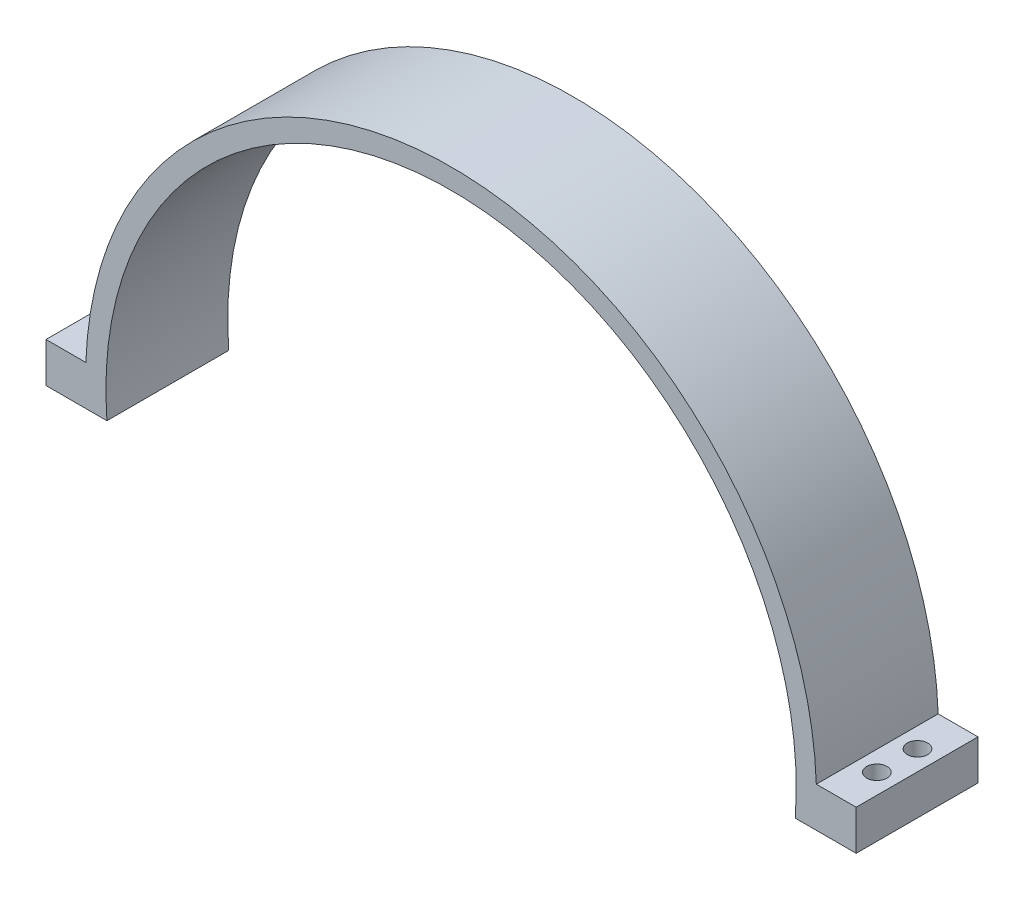
ISO-10303-21;
HEADER;
FILE_DESCRIPTION(('STEP AP214'),'2;1');
FILE_NAME('part.step','',(''),(''),'','','');
FILE_SCHEMA(('AUTOMOTIVE_DESIGN { 1 0 10303 214 1 1 1 1 }'));
ENDSEC;
DATA;
#1=APPLICATION_CONTEXT('core data for automotive mechanical design processes');
#2=APPLICATION_PROTOCOL_DEFINITION('international standard','automotive_design',2000,#1);
#3=PRODUCT_CONTEXT('',#1,'mechanical');
#4=PRODUCT('Part','Part','',(#3));
#5=PRODUCT_RELATED_PRODUCT_CATEGORY('part','',(#4));
#6=PRODUCT_DEFINITION_FORMATION('','',#4);
#7=PRODUCT_DEFINITION_CONTEXT('part definition',#1,'design');
#8=PRODUCT_DEFINITION('design','',#6,#7);
#9=PRODUCT_DEFINITION_SHAPE('','',#8);
#10=(LENGTH_UNIT() NAMED_UNIT(*) SI_UNIT(.MILLI.,.METRE.));
#11=(NAMED_UNIT(*) PLANE_ANGLE_UNIT() SI_UNIT($,.RADIAN.));
#12=(NAMED_UNIT(*) SI_UNIT($,.STERADIAN.) SOLID_ANGLE_UNIT());
#13=UNCERTAINTY_MEASURE_WITH_UNIT(LENGTH_MEASURE(1.E-05),#10,'distance_accuracy_value','');
#14=(GEOMETRIC_REPRESENTATION_CONTEXT(3) GLOBAL_UNCERTAINTY_ASSIGNED_CONTEXT((#13)) GLOBAL_UNIT_ASSIGNED_CONTEXT((#10,
#11,#12)) REPRESENTATION_CONTEXT('',''));
#15=CARTESIAN_POINT('',(0.,0.,0.));
#16=DIRECTION('',(0.,0.,1.));
#17=DIRECTION('',(1.,0.,0.));
#18=AXIS2_PLACEMENT_3D('',#15,#16,#17);
#19=CARTESIAN_POINT('',(0.,0.,30.));
#20=DIRECTION('',(0.,0.,-1.));
#21=DIRECTION('',(-1.,0.,0.));
#22=AXIS2_PLACEMENT_3D('',#19,#20,#21);
#23=CYLINDRICAL_SURFACE('',#22,90.);
#24=CARTESIAN_POINT('',(0.,0.,0.));
#25=DIRECTION('',(0.,0.,1.));
#26=DIRECTION('',(1.,0.,0.));
#27=AXIS2_PLACEMENT_3D('',#24,#25,#26);
#28=CIRCLE('',#27,90.);
#29=CARTESIAN_POINT('',(89.9391287993248,3.30954843120012,0.));
#30=VERTEX_POINT('',#29);
#31=CARTESIAN_POINT('',(-89.9391287993248,3.30954843120012,0.));
#32=VERTEX_POINT('',#31);
#33=EDGE_CURVE('E131',#30,#32,#28,.T.);
#34=ORIENTED_EDGE('',*,*,#33,.T.);
#35=DIRECTION('',(0.,0.,-1.));
#36=VECTOR('',#35,1.);
#37=CARTESIAN_POINT('',(-89.9391287993248,3.30954843120012,30.));
#38=LINE('',#37,#36);
#39=CARTESIAN_POINT('',(-89.9391287993248,3.30954843120012,30.));
#40=VERTEX_POINT('',#39);
#41=EDGE_CURVE('E11',#40,#32,#38,.T.);
#42=ORIENTED_EDGE('',*,*,#41,.F.);
#43=CARTESIAN_POINT('',(0.,0.,30.));
#44=DIRECTION('',(0.,0.,1.));
#45=DIRECTION('',(1.,0.,0.));
#46=AXIS2_PLACEMENT_3D('',#43,#44,#45);
#47=CIRCLE('',#46,90.);
#48=CARTESIAN_POINT('',(89.9391287993248,3.30954843120012,30.));
#49=VERTEX_POINT('',#48);
#50=EDGE_CURVE('E145',#49,#40,#47,.T.);
#51=ORIENTED_EDGE('',*,*,#50,.F.);
#52=DIRECTION('',(0.,0.,-1.));
#53=VECTOR('',#52,1.);
#54=CARTESIAN_POINT('',(89.9391287993248,3.30954843120012,30.));
#55=LINE('',#54,#53);
#56=EDGE_CURVE('E127',#49,#30,#55,.T.);
#57=ORIENTED_EDGE('',*,*,#56,.T.);
#58=EDGE_LOOP('',(#34,#42,#51,#57));
#59=FACE_BOUND('',#58,.T.);
#60=ADVANCED_FACE('F33',(#59),#23,.T.);
#61=CARTESIAN_POINT('',(-89.9391287993248,3.30954843120012,30.));
#62=DIRECTION('',(0.,-1.,0.));
#63=DIRECTION('',(1.,0.,0.));
#64=AXIS2_PLACEMENT_3D('',#61,#62,#63);
#65=PLANE('',#64);
#66=CARTESIAN_POINT('',(-94.8441439277395,3.30954843119991,20.));
#67=DIRECTION('',(0.,1.,0.));
#68=DIRECTION('',(-1.,0.,0.));
#69=AXIS2_PLACEMENT_3D('',#66,#67,#68);
#70=CIRCLE('',#69,2.5);
#71=CARTESIAN_POINT('',(-97.3441439277395,3.30954843119991,20.));
#72=VERTEX_POINT('',#71);
#73=EDGE_CURVE('E258',#72,#72,#70,.T.);
#74=ORIENTED_EDGE('',*,*,#73,.F.);
#75=EDGE_LOOP('',(#74));
#76=FACE_BOUND('',#75,.T.);
#77=CARTESIAN_POINT('',(-94.8441439277395,3.30954843119991,10.));
#78=DIRECTION('',(0.,1.,0.));
#79=DIRECTION('',(-1.,0.,0.));
#80=AXIS2_PLACEMENT_3D('',#77,#78,#79);
#81=CIRCLE('',#80,2.5);
#82=CARTESIAN_POINT('',(-97.3441439277395,3.30954843119991,10.));
#83=VERTEX_POINT('',#82);
#84=EDGE_CURVE('E168',#83,#83,#81,.T.);
#85=ORIENTED_EDGE('',*,*,#84,.F.);
#86=EDGE_LOOP('',(#85));
#87=FACE_BOUND('',#86,.T.);
#88=DIRECTION('',(-1.,0.,0.));
#89=VECTOR('',#88,1.);
#90=CARTESIAN_POINT('',(-89.9391287993248,3.30954843120012,0.));
#91=LINE('',#90,#89);
#92=CARTESIAN_POINT('',(-99.7491590561541,3.30954843120012,0.));
#93=VERTEX_POINT('',#92);
#94=EDGE_CURVE('E134',#32,#93,#91,.T.);
#95=ORIENTED_EDGE('',*,*,#94,.T.);
#96=DIRECTION('',(0.,0.,-1.));
#97=VECTOR('',#96,1.);
#98=CARTESIAN_POINT('',(-99.7491590561541,3.30954843120012,30.));
#99=LINE('',#98,#97);
#100=CARTESIAN_POINT('',(-99.7491590561541,3.30954843120012,30.));
#101=VERTEX_POINT('',#100);
#102=EDGE_CURVE('E42',#101,#93,#99,.T.);
#103=ORIENTED_EDGE('',*,*,#102,.F.);
#104=DIRECTION('',(-1.,0.,0.));
#105=VECTOR('',#104,1.);
#106=CARTESIAN_POINT('',(-89.9391287993248,3.30954843120012,30.));
#107=LINE('',#106,#105);
#108=EDGE_CURVE('E94',#40,#101,#107,.T.);
#109=ORIENTED_EDGE('',*,*,#108,.F.);
#110=ORIENTED_EDGE('',*,*,#41,.T.);
#111=EDGE_LOOP('',(#95,#103,#109,#110));
#112=FACE_BOUND('',#111,.T.);
#113=ADVANCED_FACE('F208',(#76,#87,#112),#65,.F.);
#114=CARTESIAN_POINT('',(-99.7491590561541,3.30954843120012,30.));
#115=DIRECTION('',(1.,0.,0.));
#116=DIRECTION('',(0.,0.,-1.));
#117=AXIS2_PLACEMENT_3D('',#114,#115,#116);
#118=PLANE('',#117);
#119=DIRECTION('',(0.,-1.,0.));
#120=VECTOR('',#119,1.);
#121=CARTESIAN_POINT('',(-99.7491590561541,3.30954843120012,0.));
#122=LINE('',#121,#120);
#123=CARTESIAN_POINT('',(-99.7491590561541,-6.52533824982976,0.));
#124=VERTEX_POINT('',#123);
#125=EDGE_CURVE('E136',#93,#124,#122,.T.);
#126=ORIENTED_EDGE('',*,*,#125,.T.);
#127=DIRECTION('',(0.,0.,-1.));
#128=VECTOR('',#127,1.);
#129=CARTESIAN_POINT('',(-99.7491590561541,-6.52533824982976,30.));
#130=LINE('',#129,#128);
#131=CARTESIAN_POINT('',(-99.7491590561541,-6.52533824982976,30.));
#132=VERTEX_POINT('',#131);
#133=EDGE_CURVE('E152',#132,#124,#130,.T.);
#134=ORIENTED_EDGE('',*,*,#133,.F.);
#135=DIRECTION('',(0.,-1.,0.));
#136=VECTOR('',#135,1.);
#137=CARTESIAN_POINT('',(-99.7491590561541,3.30954843120012,30.));
#138=LINE('',#137,#136);
#139=EDGE_CURVE('E174',#101,#132,#138,.T.);
#140=ORIENTED_EDGE('',*,*,#139,.F.);
#141=ORIENTED_EDGE('',*,*,#102,.T.);
#142=EDGE_LOOP('',(#126,#134,#140,#141));
#143=FACE_BOUND('',#142,.T.);
#144=ADVANCED_FACE('F212',(#143),#118,.F.);
#145=CARTESIAN_POINT('',(-99.7491590561541,-6.52533824982976,30.));
#146=DIRECTION('',(0.,1.,0.));
#147=DIRECTION('',(-1.,0.,0.));
#148=AXIS2_PLACEMENT_3D('',#145,#146,#147);
#149=PLANE('',#148);
#150=CARTESIAN_POINT('',(-94.8441439277395,-6.52533824982976,20.));
#151=DIRECTION('',(0.,1.,0.));
#152=DIRECTION('',(-1.,0.,0.));
#153=AXIS2_PLACEMENT_3D('',#150,#151,#152);
#154=CIRCLE('',#153,2.5);
#155=CARTESIAN_POINT('',(-97.3441439277395,-6.52533824982976,20.));
#156=VERTEX_POINT('',#155);
#157=EDGE_CURVE('E36',#156,#156,#154,.T.);
#158=ORIENTED_EDGE('',*,*,#157,.T.);
#159=EDGE_LOOP('',(#158));
#160=FACE_BOUND('',#159,.T.);
#161=CARTESIAN_POINT('',(-94.8441439277395,-6.52533824982976,10.));
#162=DIRECTION('',(0.,1.,0.));
#163=DIRECTION('',(-1.,0.,0.));
#164=AXIS2_PLACEMENT_3D('',#161,#162,#163);
#165=CIRCLE('',#164,2.5);
#166=CARTESIAN_POINT('',(-97.3441439277395,-6.52533824982976,10.));
#167=VERTEX_POINT('',#166);
#168=EDGE_CURVE('E156',#167,#167,#165,.T.);
#169=ORIENTED_EDGE('',*,*,#168,.T.);
#170=EDGE_LOOP('',(#169));
#171=FACE_BOUND('',#170,.T.);
#172=DIRECTION('',(1.,0.,0.));
#173=VECTOR('',#172,1.);
#174=CARTESIAN_POINT('',(-99.7491590561541,-6.52533824982976,0.));
#175=LINE('',#174,#173);
#176=CARTESIAN_POINT('',(-84.7491590561541,-6.52533824982976,0.));
#177=VERTEX_POINT('',#176);
#178=EDGE_CURVE('E138',#124,#177,#175,.T.);
#179=ORIENTED_EDGE('',*,*,#178,.T.);
#180=DIRECTION('',(0.,0.,-1.));
#181=VECTOR('',#180,1.);
#182=CARTESIAN_POINT('',(-84.7491590561541,-6.52533824982976,30.));
#183=LINE('',#182,#181);
#184=CARTESIAN_POINT('',(-84.7491590561541,-6.52533824982976,30.));
#185=VERTEX_POINT('',#184);
#186=EDGE_CURVE('E149',#185,#177,#183,.T.);
#187=ORIENTED_EDGE('',*,*,#186,.F.);
#188=DIRECTION('',(1.,0.,0.));
#189=VECTOR('',#188,1.);
#190=CARTESIAN_POINT('',(-99.7491590561541,-6.52533824982976,30.));
#191=LINE('',#190,#189);
#192=EDGE_CURVE('E176',#132,#185,#191,.T.);
#193=ORIENTED_EDGE('',*,*,#192,.F.);
#194=ORIENTED_EDGE('',*,*,#133,.T.);
#195=EDGE_LOOP('',(#179,#187,#193,#194));
#196=FACE_BOUND('',#195,.T.);
#197=ADVANCED_FACE('F182',(#160,#171,#196),#149,.F.);
#198=CARTESIAN_POINT('',(0.,0.,30.));
#199=DIRECTION('',(0.,0.,-1.));
#200=DIRECTION('',(-1.,0.,0.));
#201=AXIS2_PLACEMENT_3D('',#198,#199,#200);
#202=CYLINDRICAL_SURFACE('',#201,85.);
#203=CARTESIAN_POINT('',(0.,0.,0.));
#204=DIRECTION('',(0.,0.,-1.));
#205=DIRECTION('',(1.,0.,0.));
#206=AXIS2_PLACEMENT_3D('',#203,#204,#205);
#207=CIRCLE('',#206,85.);
#208=CARTESIAN_POINT('',(84.7491590561541,-6.52533824982982,0.));
#209=VERTEX_POINT('',#208);
#210=EDGE_CURVE('E140',#177,#209,#207,.T.);
#211=ORIENTED_EDGE('',*,*,#210,.T.);
#212=DIRECTION('',(0.,0.,-1.));
#213=VECTOR('',#212,1.);
#214=CARTESIAN_POINT('',(84.7491590561541,-6.52533824982982,30.));
#215=LINE('',#214,#213);
#216=CARTESIAN_POINT('',(84.7491590561541,-6.52533824982982,30.));
#217=VERTEX_POINT('',#216);
#218=EDGE_CURVE('E122',#217,#209,#215,.T.);
#219=ORIENTED_EDGE('',*,*,#218,.F.);
#220=CARTESIAN_POINT('',(0.,0.,30.));
#221=DIRECTION('',(0.,0.,-1.));
#222=DIRECTION('',(1.,0.,0.));
#223=AXIS2_PLACEMENT_3D('',#220,#221,#222);
#224=CIRCLE('',#223,85.);
#225=EDGE_CURVE('E113',#185,#217,#224,.T.);
#226=ORIENTED_EDGE('',*,*,#225,.F.);
#227=ORIENTED_EDGE('',*,*,#186,.T.);
#228=EDGE_LOOP('',(#211,#219,#226,#227));
#229=FACE_BOUND('',#228,.T.);
#230=ADVANCED_FACE('F186',(#229),#202,.F.);
#231=CARTESIAN_POINT('',(99.7491590561542,-6.52533824982974,30.));
#232=DIRECTION('',(0.,1.,0.));
#233=DIRECTION('',(-1.,0.,0.));
#234=AXIS2_PLACEMENT_3D('',#231,#232,#233);
#235=PLANE('',#234);
#236=CARTESIAN_POINT('',(94.8441439277395,-6.52533824982976,9.99999999999998));
#237=DIRECTION('',(0.,1.,0.));
#238=DIRECTION('',(-1.,0.,0.));
#239=AXIS2_PLACEMENT_3D('',#236,#237,#238);
#240=CIRCLE('',#239,2.5);
#241=CARTESIAN_POINT('',(92.3441439277395,-6.52533824982978,9.99999999999998));
#242=VERTEX_POINT('',#241);
#243=EDGE_CURVE('E158',#242,#242,#240,.T.);
#244=ORIENTED_EDGE('',*,*,#243,.T.);
#245=EDGE_LOOP('',(#244));
#246=FACE_BOUND('',#245,.T.);
#247=CARTESIAN_POINT('',(94.8441439277395,-6.52533824982976,20.));
#248=DIRECTION('',(0.,1.,0.));
#249=DIRECTION('',(-1.,0.,0.));
#250=AXIS2_PLACEMENT_3D('',#247,#248,#249);
#251=CIRCLE('',#250,2.5);
#252=CARTESIAN_POINT('',(92.3441439277394,-6.52533824982978,20.));
#253=VERTEX_POINT('',#252);
#254=EDGE_CURVE('E163',#253,#253,#251,.T.);
#255=ORIENTED_EDGE('',*,*,#254,.T.);
#256=EDGE_LOOP('',(#255));
#257=FACE_BOUND('',#256,.T.);
#258=DIRECTION('',(1.,0.,0.));
#259=VECTOR('',#258,1.);
#260=CARTESIAN_POINT('',(99.7491590561542,-6.52533824982974,0.));
#261=LINE('',#260,#259);
#262=CARTESIAN_POINT('',(99.7491590561542,-6.52533824982974,0.));
#263=VERTEX_POINT('',#262);
#264=EDGE_CURVE('E121',#209,#263,#261,.T.);
#265=ORIENTED_EDGE('',*,*,#264,.T.);
#266=DIRECTION('',(0.,0.,-1.));
#267=VECTOR('',#266,1.);
#268=CARTESIAN_POINT('',(99.7491590561542,-6.52533824982974,30.));
#269=LINE('',#268,#267);
#270=CARTESIAN_POINT('',(99.7491590561542,-6.52533824982974,30.));
#271=VERTEX_POINT('',#270);
#272=EDGE_CURVE('E118',#271,#263,#269,.T.);
#273=ORIENTED_EDGE('',*,*,#272,.F.);
#274=DIRECTION('',(1.,0.,0.));
#275=VECTOR('',#274,1.);
#276=CARTESIAN_POINT('',(99.7491590561542,-6.52533824982974,30.));
#277=LINE('',#276,#275);
#278=EDGE_CURVE('E107',#217,#271,#277,.T.);
#279=ORIENTED_EDGE('',*,*,#278,.F.);
#280=ORIENTED_EDGE('',*,*,#218,.T.);
#281=EDGE_LOOP('',(#265,#273,#279,#280));
#282=FACE_BOUND('',#281,.T.);
#283=ADVANCED_FACE('F119',(#246,#257,#282),#235,.F.);
#284=CARTESIAN_POINT('',(99.7491590561542,3.30954843120014,30.));
#285=DIRECTION('',(-1.,0.,0.));
#286=DIRECTION('',(0.,0.,1.));
#287=AXIS2_PLACEMENT_3D('',#284,#285,#286);
#288=PLANE('',#287);
#289=DIRECTION('',(0.,1.,0.));
#290=VECTOR('',#289,1.);
#291=CARTESIAN_POINT('',(99.7491590561542,3.30954843120014,0.));
#292=LINE('',#291,#290);
#293=CARTESIAN_POINT('',(99.7491590561542,3.30954843120014,0.));
#294=VERTEX_POINT('',#293);
#295=EDGE_CURVE('E80',#263,#294,#292,.T.);
#296=ORIENTED_EDGE('',*,*,#295,.T.);
#297=DIRECTION('',(0.,0.,-1.));
#298=VECTOR('',#297,1.);
#299=CARTESIAN_POINT('',(99.7491590561542,3.30954843120014,30.));
#300=LINE('',#299,#298);
#301=CARTESIAN_POINT('',(99.7491590561542,3.30954843120014,30.));
#302=VERTEX_POINT('',#301);
#303=EDGE_CURVE('E123',#302,#294,#300,.T.);
#304=ORIENTED_EDGE('',*,*,#303,.F.);
#305=DIRECTION('',(0.,1.,0.));
#306=VECTOR('',#305,1.);
#307=CARTESIAN_POINT('',(99.7491590561542,3.30954843120014,30.));
#308=LINE('',#307,#306);
#309=EDGE_CURVE('E111',#271,#302,#308,.T.);
#310=ORIENTED_EDGE('',*,*,#309,.F.);
#311=ORIENTED_EDGE('',*,*,#272,.T.);
#312=EDGE_LOOP('',(#296,#304,#310,#311));
#313=FACE_BOUND('',#312,.T.);
#314=ADVANCED_FACE('F125',(#313),#288,.F.);
#315=CARTESIAN_POINT('',(89.9391287993248,3.30954843120012,30.));
#316=DIRECTION('',(0.,-1.,0.));
#317=DIRECTION('',(1.,0.,0.));
#318=AXIS2_PLACEMENT_3D('',#315,#316,#317);
#319=PLANE('',#318);
#320=CARTESIAN_POINT('',(94.8441439277395,3.30954843119991,9.99999999999998));
#321=DIRECTION('',(0.,1.,0.));
#322=DIRECTION('',(1.,0.,0.));
#323=AXIS2_PLACEMENT_3D('',#320,#321,#322);
#324=CIRCLE('',#323,2.5);
#325=CARTESIAN_POINT('',(97.3441439277394,3.30954843119991,9.99999999999998));
#326=VERTEX_POINT('',#325);
#327=EDGE_CURVE('E263',#326,#326,#324,.T.);
#328=ORIENTED_EDGE('',*,*,#327,.F.);
#329=EDGE_LOOP('',(#328));
#330=FACE_BOUND('',#329,.T.);
#331=CARTESIAN_POINT('',(94.8441439277395,3.30954843119991,20.));
#332=DIRECTION('',(0.,1.,0.));
#333=DIRECTION('',(1.,0.,0.));
#334=AXIS2_PLACEMENT_3D('',#331,#332,#333);
#335=CIRCLE('',#334,2.5);
#336=CARTESIAN_POINT('',(97.3441439277395,3.30954843119991,20.));
#337=VERTEX_POINT('',#336);
#338=EDGE_CURVE('E260',#337,#337,#335,.T.);
#339=ORIENTED_EDGE('',*,*,#338,.F.);
#340=EDGE_LOOP('',(#339));
#341=FACE_BOUND('',#340,.T.);
#342=DIRECTION('',(-1.,0.,0.));
#343=VECTOR('',#342,1.);
#344=CARTESIAN_POINT('',(89.9391287993248,3.30954843120012,0.));
#345=LINE('',#344,#343);
#346=EDGE_CURVE('E86',#294,#30,#345,.T.);
#347=ORIENTED_EDGE('',*,*,#346,.T.);
#348=ORIENTED_EDGE('',*,*,#56,.F.);
#349=DIRECTION('',(-1.,0.,0.));
#350=VECTOR('',#349,1.);
#351=CARTESIAN_POINT('',(89.9391287993248,3.30954843120012,30.));
#352=LINE('',#351,#350);
#353=EDGE_CURVE('E51',#302,#49,#352,.T.);
#354=ORIENTED_EDGE('',*,*,#353,.F.);
#355=ORIENTED_EDGE('',*,*,#303,.T.);
#356=EDGE_LOOP('',(#347,#348,#354,#355));
#357=FACE_BOUND('',#356,.T.);
#358=ADVANCED_FACE('F194',(#330,#341,#357),#319,.F.);
#359=CARTESIAN_POINT('',(0.,0.,30.));
#360=DIRECTION('',(0.,0.,1.));
#361=DIRECTION('',(1.,0.,0.));
#362=AXIS2_PLACEMENT_3D('',#359,#360,#361);
#363=PLANE('',#362);
#364=ORIENTED_EDGE('',*,*,#50,.T.);
#365=ORIENTED_EDGE('',*,*,#108,.T.);
#366=ORIENTED_EDGE('',*,*,#139,.T.);
#367=ORIENTED_EDGE('',*,*,#192,.T.);
#368=ORIENTED_EDGE('',*,*,#225,.T.);
#369=ORIENTED_EDGE('',*,*,#278,.T.);
#370=ORIENTED_EDGE('',*,*,#309,.T.);
#371=ORIENTED_EDGE('',*,*,#353,.T.);
#372=EDGE_LOOP('',(#364,#365,#366,#367,#368,#369,#370,#371));
#373=FACE_BOUND('',#372,.T.);
#374=ADVANCED_FACE('F109',(#373),#363,.T.);
#375=CARTESIAN_POINT('',(0.,0.,0.));
#376=DIRECTION('',(0.,0.,1.));
#377=DIRECTION('',(1.,0.,0.));
#378=AXIS2_PLACEMENT_3D('',#375,#376,#377);
#379=PLANE('',#378);
#380=ORIENTED_EDGE('',*,*,#33,.F.);
#381=ORIENTED_EDGE('',*,*,#346,.F.);
#382=ORIENTED_EDGE('',*,*,#295,.F.);
#383=ORIENTED_EDGE('',*,*,#264,.F.);
#384=ORIENTED_EDGE('',*,*,#210,.F.);
#385=ORIENTED_EDGE('',*,*,#178,.F.);
#386=ORIENTED_EDGE('',*,*,#125,.F.);
#387=ORIENTED_EDGE('',*,*,#94,.F.);
#388=EDGE_LOOP('',(#380,#381,#382,#383,#384,#385,#386,#387));
#389=FACE_BOUND('',#388,.T.);
#390=ADVANCED_FACE('F189',(#389),#379,.F.);
#391=CARTESIAN_POINT('',(94.8441439277395,-26.6904515688001,20.));
#392=DIRECTION('',(0.,1.,0.));
#393=DIRECTION('',(-1.,0.,0.));
#394=AXIS2_PLACEMENT_3D('',#391,#392,#393);
#395=CYLINDRICAL_SURFACE('',#394,2.5);
#396=ORIENTED_EDGE('',*,*,#338,.T.);
#397=EDGE_LOOP('',(#396));
#398=FACE_BOUND('',#397,.T.);
#399=ORIENTED_EDGE('',*,*,#254,.F.);
#400=EDGE_LOOP('',(#399));
#401=FACE_BOUND('',#400,.T.);
#402=ADVANCED_FACE('F233',(#398,#401),#395,.F.);
#403=CARTESIAN_POINT('',(94.8441439277395,-26.6904515688001,9.99999999999998));
#404=DIRECTION('',(0.,1.,0.));
#405=DIRECTION('',(-1.,0.,0.));
#406=AXIS2_PLACEMENT_3D('',#403,#404,#405);
#407=CYLINDRICAL_SURFACE('',#406,2.5);
#408=ORIENTED_EDGE('',*,*,#327,.T.);
#409=EDGE_LOOP('',(#408));
#410=FACE_BOUND('',#409,.T.);
#411=ORIENTED_EDGE('',*,*,#243,.F.);
#412=EDGE_LOOP('',(#411));
#413=FACE_BOUND('',#412,.T.);
#414=ADVANCED_FACE('F235',(#410,#413),#407,.F.);
#415=CARTESIAN_POINT('',(-94.8441439277395,-26.6904515688001,10.));
#416=DIRECTION('',(0.,1.,0.));
#417=DIRECTION('',(-1.,0.,0.));
#418=AXIS2_PLACEMENT_3D('',#415,#416,#417);
#419=CYLINDRICAL_SURFACE('',#418,2.5);
#420=ORIENTED_EDGE('',*,*,#84,.T.);
#421=EDGE_LOOP('',(#420));
#422=FACE_BOUND('',#421,.T.);
#423=ORIENTED_EDGE('',*,*,#168,.F.);
#424=EDGE_LOOP('',(#423));
#425=FACE_BOUND('',#424,.T.);
#426=ADVANCED_FACE('F242',(#422,#425),#419,.F.);
#427=CARTESIAN_POINT('',(-94.8441439277395,-26.6904515688001,20.));
#428=DIRECTION('',(0.,1.,0.));
#429=DIRECTION('',(-1.,0.,0.));
#430=AXIS2_PLACEMENT_3D('',#427,#428,#429);
#431=CYLINDRICAL_SURFACE('',#430,2.5);
#432=ORIENTED_EDGE('',*,*,#73,.T.);
#433=EDGE_LOOP('',(#432));
#434=FACE_BOUND('',#433,.T.);
#435=ORIENTED_EDGE('',*,*,#157,.F.);
#436=EDGE_LOOP('',(#435));
#437=FACE_BOUND('',#436,.T.);
#438=ADVANCED_FACE('F247',(#434,#437),#431,.F.);
#439=CLOSED_SHELL('',(#60,#113,#144,#197,#230,#283,#314,#358,#374,#390,#402,#414,#426,#438));
#440=MANIFOLD_SOLID_BREP('B2',#439);
#441=ADVANCED_BREP_SHAPE_REPRESENTATION('',(#18,#440),#14);
#442=SHAPE_DEFINITION_REPRESENTATION(#9,#441);
ENDSEC;
END-ISO-10303-21;
